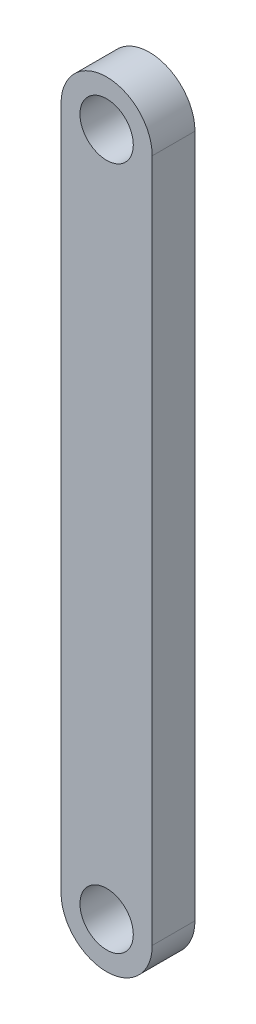
ISO-10303-21;
HEADER;
FILE_DESCRIPTION(('STEP AP214'),'2;1');
FILE_NAME('part.step','',(''),(''),'','','');
FILE_SCHEMA(('AUTOMOTIVE_DESIGN { 1 0 10303 214 1 1 1 1 }'));
ENDSEC;
DATA;
#1=APPLICATION_CONTEXT('core data for automotive mechanical design processes');
#2=APPLICATION_PROTOCOL_DEFINITION('international standard','automotive_design',2000,#1);
#3=PRODUCT_CONTEXT('',#1,'mechanical');
#4=PRODUCT('Part','Part','',(#3));
#5=PRODUCT_RELATED_PRODUCT_CATEGORY('part','',(#4));
#6=PRODUCT_DEFINITION_FORMATION('','',#4);
#7=PRODUCT_DEFINITION_CONTEXT('part definition',#1,'design');
#8=PRODUCT_DEFINITION('design','',#6,#7);
#9=PRODUCT_DEFINITION_SHAPE('','',#8);
#10=(LENGTH_UNIT() NAMED_UNIT(*) SI_UNIT(.MILLI.,.METRE.));
#11=(NAMED_UNIT(*) PLANE_ANGLE_UNIT() SI_UNIT($,.RADIAN.));
#12=(NAMED_UNIT(*) SI_UNIT($,.STERADIAN.) SOLID_ANGLE_UNIT());
#13=UNCERTAINTY_MEASURE_WITH_UNIT(LENGTH_MEASURE(1.E-05),#10,'distance_accuracy_value','');
#14=(GEOMETRIC_REPRESENTATION_CONTEXT(3) GLOBAL_UNCERTAINTY_ASSIGNED_CONTEXT((#13)) GLOBAL_UNIT_ASSIGNED_CONTEXT((#10,
#11,#12)) REPRESENTATION_CONTEXT('',''));
#15=CARTESIAN_POINT('',(0.,0.,0.));
#16=DIRECTION('',(0.,0.,1.));
#17=DIRECTION('',(1.,0.,0.));
#18=AXIS2_PLACEMENT_3D('',#15,#16,#17);
#19=CARTESIAN_POINT('',(0.,48.,3.));
#20=DIRECTION('',(0.,0.,1.));
#21=DIRECTION('',(1.,0.,0.));
#22=AXIS2_PLACEMENT_3D('',#19,#20,#21);
#23=PLANE('',#22);
#24=CARTESIAN_POINT('',(0.,0.,3.));
#25=DIRECTION('',(0.,0.,1.));
#26=DIRECTION('',(1.,0.,0.));
#27=AXIS2_PLACEMENT_3D('',#24,#25,#26);
#28=CIRCLE('',#27,1.872);
#29=CARTESIAN_POINT('',(1.872,0.,3.));
#30=VERTEX_POINT('',#29);
#31=EDGE_CURVE('E108',#30,#30,#28,.T.);
#32=ORIENTED_EDGE('',*,*,#31,.F.);
#33=EDGE_LOOP('',(#32));
#34=FACE_BOUND('',#33,.T.);
#35=CARTESIAN_POINT('',(0.,48.,3.));
#36=DIRECTION('',(0.,0.,1.));
#37=DIRECTION('',(1.,0.,0.));
#38=AXIS2_PLACEMENT_3D('',#35,#36,#37);
#39=CIRCLE('',#38,3.2);
#40=CARTESIAN_POINT('',(3.2,48.,3.));
#41=VERTEX_POINT('',#40);
#42=CARTESIAN_POINT('',(-3.2,48.,3.));
#43=VERTEX_POINT('',#42);
#44=EDGE_CURVE('E93',#41,#43,#39,.T.);
#45=ORIENTED_EDGE('',*,*,#44,.T.);
#46=DIRECTION('',(0.,-1.,0.));
#47=VECTOR('',#46,1.);
#48=CARTESIAN_POINT('',(-3.2,48.,3.));
#49=LINE('',#48,#47);
#50=CARTESIAN_POINT('',(-3.19999999999999,0.,3.));
#51=VERTEX_POINT('',#50);
#52=EDGE_CURVE('E88',#43,#51,#49,.T.);
#53=ORIENTED_EDGE('',*,*,#52,.T.);
#54=CARTESIAN_POINT('',(0.,0.,3.));
#55=DIRECTION('',(0.,0.,1.));
#56=DIRECTION('',(1.,0.,0.));
#57=AXIS2_PLACEMENT_3D('',#54,#55,#56);
#58=CIRCLE('',#57,3.19999999999999);
#59=CARTESIAN_POINT('',(3.19999999999999,0.,3.));
#60=VERTEX_POINT('',#59);
#61=EDGE_CURVE('E91',#51,#60,#58,.T.);
#62=ORIENTED_EDGE('',*,*,#61,.T.);
#63=DIRECTION('',(0.,1.,0.));
#64=VECTOR('',#63,1.);
#65=CARTESIAN_POINT('',(3.2,48.,3.));
#66=LINE('',#65,#64);
#67=EDGE_CURVE('E58',#60,#41,#66,.T.);
#68=ORIENTED_EDGE('',*,*,#67,.T.);
#69=EDGE_LOOP('',(#45,#53,#62,#68));
#70=FACE_BOUND('',#69,.T.);
#71=CARTESIAN_POINT('',(0.,48.,3.));
#72=DIRECTION('',(0.,0.,1.));
#73=DIRECTION('',(1.,0.,0.));
#74=AXIS2_PLACEMENT_3D('',#71,#72,#73);
#75=CIRCLE('',#74,1.872);
#76=CARTESIAN_POINT('',(1.872,48.,3.));
#77=VERTEX_POINT('',#76);
#78=EDGE_CURVE('E123',#77,#77,#75,.T.);
#79=ORIENTED_EDGE('',*,*,#78,.F.);
#80=EDGE_LOOP('',(#79));
#81=FACE_BOUND('',#80,.T.);
#82=ADVANCED_FACE('F41',(#34,#70,#81),#23,.T.);
#83=CARTESIAN_POINT('',(0.,48.,0.));
#84=DIRECTION('',(0.,0.,1.));
#85=DIRECTION('',(1.,0.,0.));
#86=AXIS2_PLACEMENT_3D('',#83,#84,#85);
#87=PLANE('',#86);
#88=CARTESIAN_POINT('',(0.,48.,0.));
#89=DIRECTION('',(0.,0.,1.));
#90=DIRECTION('',(1.,0.,0.));
#91=AXIS2_PLACEMENT_3D('',#88,#89,#90);
#92=CIRCLE('',#91,3.2);
#93=CARTESIAN_POINT('',(3.2,48.,0.));
#94=VERTEX_POINT('',#93);
#95=CARTESIAN_POINT('',(-3.2,48.,0.));
#96=VERTEX_POINT('',#95);
#97=EDGE_CURVE('E105',#94,#96,#92,.T.);
#98=ORIENTED_EDGE('',*,*,#97,.F.);
#99=DIRECTION('',(0.,1.,0.));
#100=VECTOR('',#99,1.);
#101=CARTESIAN_POINT('',(3.2,48.,0.));
#102=LINE('',#101,#100);
#103=CARTESIAN_POINT('',(3.19999999999999,0.,0.));
#104=VERTEX_POINT('',#103);
#105=EDGE_CURVE('E81',#104,#94,#102,.T.);
#106=ORIENTED_EDGE('',*,*,#105,.F.);
#107=CARTESIAN_POINT('',(0.,0.,0.));
#108=DIRECTION('',(0.,0.,1.));
#109=DIRECTION('',(1.,0.,0.));
#110=AXIS2_PLACEMENT_3D('',#107,#108,#109);
#111=CIRCLE('',#110,3.19999999999999);
#112=CARTESIAN_POINT('',(-3.19999999999999,0.,0.));
#113=VERTEX_POINT('',#112);
#114=EDGE_CURVE('E75',#113,#104,#111,.T.);
#115=ORIENTED_EDGE('',*,*,#114,.F.);
#116=DIRECTION('',(0.,-1.,0.));
#117=VECTOR('',#116,1.);
#118=CARTESIAN_POINT('',(-3.2,48.,0.));
#119=LINE('',#118,#117);
#120=EDGE_CURVE('E97',#96,#113,#119,.T.);
#121=ORIENTED_EDGE('',*,*,#120,.F.);
#122=EDGE_LOOP('',(#98,#106,#115,#121));
#123=FACE_BOUND('',#122,.T.);
#124=CARTESIAN_POINT('',(0.,0.,0.));
#125=DIRECTION('',(0.,0.,1.));
#126=DIRECTION('',(1.,0.,0.));
#127=AXIS2_PLACEMENT_3D('',#124,#125,#126);
#128=CIRCLE('',#127,1.872);
#129=CARTESIAN_POINT('',(1.872,0.,0.));
#130=VERTEX_POINT('',#129);
#131=EDGE_CURVE('E120',#130,#130,#128,.T.);
#132=ORIENTED_EDGE('',*,*,#131,.T.);
#133=EDGE_LOOP('',(#132));
#134=FACE_BOUND('',#133,.T.);
#135=CARTESIAN_POINT('',(0.,48.,0.));
#136=DIRECTION('',(0.,0.,1.));
#137=DIRECTION('',(1.,0.,0.));
#138=AXIS2_PLACEMENT_3D('',#135,#136,#137);
#139=CIRCLE('',#138,1.872);
#140=CARTESIAN_POINT('',(1.872,48.,0.));
#141=VERTEX_POINT('',#140);
#142=EDGE_CURVE('E126',#141,#141,#139,.T.);
#143=ORIENTED_EDGE('',*,*,#142,.T.);
#144=EDGE_LOOP('',(#143));
#145=FACE_BOUND('',#144,.T.);
#146=ADVANCED_FACE('F116',(#123,#134,#145),#87,.F.);
#147=CARTESIAN_POINT('',(0.,48.,3.));
#148=DIRECTION('',(0.,0.,-1.));
#149=DIRECTION('',(-1.,0.,0.));
#150=AXIS2_PLACEMENT_3D('',#147,#148,#149);
#151=CYLINDRICAL_SURFACE('',#150,3.2);
#152=ORIENTED_EDGE('',*,*,#97,.T.);
#153=DIRECTION('',(0.,0.,-1.));
#154=VECTOR('',#153,1.);
#155=CARTESIAN_POINT('',(-3.2,48.,3.));
#156=LINE('',#155,#154);
#157=EDGE_CURVE('E11',#43,#96,#156,.T.);
#158=ORIENTED_EDGE('',*,*,#157,.F.);
#159=ORIENTED_EDGE('',*,*,#44,.F.);
#160=DIRECTION('',(0.,0.,-1.));
#161=VECTOR('',#160,1.);
#162=CARTESIAN_POINT('',(3.2,48.,3.));
#163=LINE('',#162,#161);
#164=EDGE_CURVE('E101',#41,#94,#163,.T.);
#165=ORIENTED_EDGE('',*,*,#164,.T.);
#166=EDGE_LOOP('',(#152,#158,#159,#165));
#167=FACE_BOUND('',#166,.T.);
#168=ADVANCED_FACE('F43',(#167),#151,.T.);
#169=CARTESIAN_POINT('',(-3.2,48.,3.));
#170=DIRECTION('',(1.,0.,0.));
#171=DIRECTION('',(0.,1.,0.));
#172=AXIS2_PLACEMENT_3D('',#169,#170,#171);
#173=PLANE('',#172);
#174=ORIENTED_EDGE('',*,*,#120,.T.);
#175=DIRECTION('',(0.,0.,-1.));
#176=VECTOR('',#175,1.);
#177=CARTESIAN_POINT('',(-3.19999999999999,0.,3.));
#178=LINE('',#177,#176);
#179=EDGE_CURVE('E50',#51,#113,#178,.T.);
#180=ORIENTED_EDGE('',*,*,#179,.F.);
#181=ORIENTED_EDGE('',*,*,#52,.F.);
#182=ORIENTED_EDGE('',*,*,#157,.T.);
#183=EDGE_LOOP('',(#174,#180,#181,#182));
#184=FACE_BOUND('',#183,.T.);
#185=ADVANCED_FACE('F96',(#184),#173,.F.);
#186=CARTESIAN_POINT('',(0.,0.,3.));
#187=DIRECTION('',(0.,0.,-1.));
#188=DIRECTION('',(-1.,0.,0.));
#189=AXIS2_PLACEMENT_3D('',#186,#187,#188);
#190=CYLINDRICAL_SURFACE('',#189,3.19999999999999);
#191=ORIENTED_EDGE('',*,*,#114,.T.);
#192=DIRECTION('',(0.,0.,-1.));
#193=VECTOR('',#192,1.);
#194=CARTESIAN_POINT('',(3.19999999999999,0.,3.));
#195=LINE('',#194,#193);
#196=EDGE_CURVE('E98',#60,#104,#195,.T.);
#197=ORIENTED_EDGE('',*,*,#196,.F.);
#198=ORIENTED_EDGE('',*,*,#61,.F.);
#199=ORIENTED_EDGE('',*,*,#179,.T.);
#200=EDGE_LOOP('',(#191,#197,#198,#199));
#201=FACE_BOUND('',#200,.T.);
#202=ADVANCED_FACE('F99',(#201),#190,.T.);
#203=CARTESIAN_POINT('',(3.2,48.,3.));
#204=DIRECTION('',(-1.,0.,0.));
#205=DIRECTION('',(0.,-1.,0.));
#206=AXIS2_PLACEMENT_3D('',#203,#204,#205);
#207=PLANE('',#206);
#208=ORIENTED_EDGE('',*,*,#105,.T.);
#209=ORIENTED_EDGE('',*,*,#164,.F.);
#210=ORIENTED_EDGE('',*,*,#67,.F.);
#211=ORIENTED_EDGE('',*,*,#196,.T.);
#212=EDGE_LOOP('',(#208,#209,#210,#211));
#213=FACE_BOUND('',#212,.T.);
#214=ADVANCED_FACE('F113',(#213),#207,.F.);
#215=CARTESIAN_POINT('',(0.,0.,3.));
#216=DIRECTION('',(0.,0.,-1.));
#217=DIRECTION('',(-1.,0.,0.));
#218=AXIS2_PLACEMENT_3D('',#215,#216,#217);
#219=CYLINDRICAL_SURFACE('',#218,1.872);
#220=ORIENTED_EDGE('',*,*,#31,.T.);
#221=EDGE_LOOP('',(#220));
#222=FACE_BOUND('',#221,.T.);
#223=ORIENTED_EDGE('',*,*,#131,.F.);
#224=EDGE_LOOP('',(#223));
#225=FACE_BOUND('',#224,.T.);
#226=ADVANCED_FACE('F143',(#222,#225),#219,.F.);
#227=CARTESIAN_POINT('',(0.,48.,3.));
#228=DIRECTION('',(0.,0.,-1.));
#229=DIRECTION('',(-1.,0.,0.));
#230=AXIS2_PLACEMENT_3D('',#227,#228,#229);
#231=CYLINDRICAL_SURFACE('',#230,1.872);
#232=ORIENTED_EDGE('',*,*,#78,.T.);
#233=EDGE_LOOP('',(#232));
#234=FACE_BOUND('',#233,.T.);
#235=ORIENTED_EDGE('',*,*,#142,.F.);
#236=EDGE_LOOP('',(#235));
#237=FACE_BOUND('',#236,.T.);
#238=ADVANCED_FACE('F132',(#234,#237),#231,.F.);
#239=CLOSED_SHELL('',(#82,#146,#168,#185,#202,#214,#226,#238));
#240=MANIFOLD_SOLID_BREP('B2',#239);
#241=ADVANCED_BREP_SHAPE_REPRESENTATION('',(#18,#240),#14);
#242=SHAPE_DEFINITION_REPRESENTATION(#9,#241);
ENDSEC;
END-ISO-10303-21;
